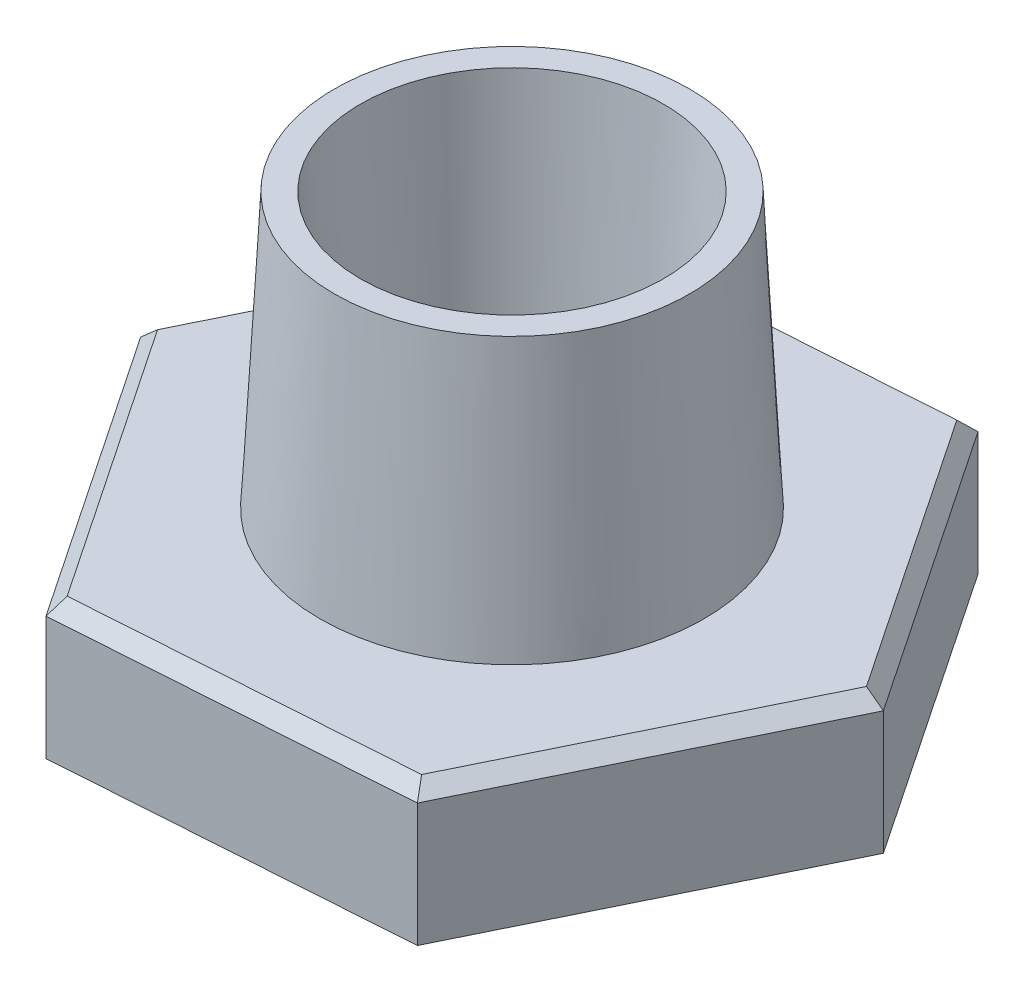
ISO-10303-21;
HEADER;
FILE_DESCRIPTION(('STEP AP214'),'2;1');
FILE_NAME('part.step','',(''),(''),'','','');
FILE_SCHEMA(('AUTOMOTIVE_DESIGN { 1 0 10303 214 1 1 1 1 }'));
ENDSEC;
DATA;
#1=APPLICATION_CONTEXT('core data for automotive mechanical design processes');
#2=APPLICATION_PROTOCOL_DEFINITION('international standard','automotive_design',2000,#1);
#3=PRODUCT_CONTEXT('',#1,'mechanical');
#4=PRODUCT('Part','Part','',(#3));
#5=PRODUCT_RELATED_PRODUCT_CATEGORY('part','',(#4));
#6=PRODUCT_DEFINITION_FORMATION('','',#4);
#7=PRODUCT_DEFINITION_CONTEXT('part definition',#1,'design');
#8=PRODUCT_DEFINITION('design','',#6,#7);
#9=PRODUCT_DEFINITION_SHAPE('','',#8);
#10=(LENGTH_UNIT() NAMED_UNIT(*) SI_UNIT(.MILLI.,.METRE.));
#11=(NAMED_UNIT(*) PLANE_ANGLE_UNIT() SI_UNIT($,.RADIAN.));
#12=(NAMED_UNIT(*) SI_UNIT($,.STERADIAN.) SOLID_ANGLE_UNIT());
#13=UNCERTAINTY_MEASURE_WITH_UNIT(LENGTH_MEASURE(1.E-05),#10,'distance_accuracy_value','');
#14=(GEOMETRIC_REPRESENTATION_CONTEXT(3) GLOBAL_UNCERTAINTY_ASSIGNED_CONTEXT((#13)) GLOBAL_UNIT_ASSIGNED_CONTEXT((#10,
#11,#12)) REPRESENTATION_CONTEXT('',''));
#15=CARTESIAN_POINT('',(0.,0.,0.));
#16=DIRECTION('',(0.,0.,1.));
#17=DIRECTION('',(1.,0.,0.));
#18=AXIS2_PLACEMENT_3D('',#15,#16,#17);
#19=CARTESIAN_POINT('',(0.,5.,0.));
#20=DIRECTION('',(0.,1.,0.));
#21=DIRECTION('',(0.,0.,1.));
#22=AXIS2_PLACEMENT_3D('',#19,#20,#21);
#23=PLANE('',#22);
#24=DIRECTION('',(-0.439571584386318,0.,0.898207560756478));
#25=VECTOR('',#24,1.);
#26=CARTESIAN_POINT('',(-12.2228338862521,5.,1.08888251084367));
#27=LINE('',#26,#25);
#28=CARTESIAN_POINT('',(-6.76641827592076,5.,-10.0605955944609));
#29=VERTEX_POINT('',#28);
#30=CARTESIAN_POINT('',(-12.0959404999653,5.,0.829592322348212));
#31=VERTEX_POINT('',#30);
#32=EDGE_CURVE('E115',#29,#31,#27,.T.);
#33=ORIENTED_EDGE('',*,*,#32,.T.);
#34=DIRECTION('',(0.558084773293205,0.,0.829783939238566));
#35=VECTOR('',#34,1.);
#36=CARTESIAN_POINT('',(-5.16841702699885,5.,11.1297259071535));
#37=LINE('',#36,#35);
#38=CARTESIAN_POINT('',(-5.32952222404458,5.,10.8901879168091));
#39=VERTEX_POINT('',#38);
#40=EDGE_CURVE('E164',#31,#39,#37,.T.);
#41=ORIENTED_EDGE('',*,*,#40,.T.);
#42=DIRECTION('',(0.997656357679524,0.,-0.0684236215179123));
#43=VECTOR('',#42,1.);
#44=CARTESIAN_POINT('',(7.05441685925327,5.,10.0408433963098));
#45=LINE('',#44,#43);
#46=CARTESIAN_POINT('',(6.76641827592076,5.,10.0605955944609));
#47=VERTEX_POINT('',#46);
#48=EDGE_CURVE('E162',#39,#47,#45,.T.);
#49=ORIENTED_EDGE('',*,*,#48,.T.);
#50=DIRECTION('',(0.439571584386318,0.,-0.898207560756478));
#51=VECTOR('',#50,1.);
#52=CARTESIAN_POINT('',(12.2228338862521,5.,-1.08888251084367));
#53=LINE('',#52,#51);
#54=CARTESIAN_POINT('',(12.0959404999653,5.,-0.829592322348215));
#55=VERTEX_POINT('',#54);
#56=EDGE_CURVE('E160',#47,#55,#53,.T.);
#57=ORIENTED_EDGE('',*,*,#56,.T.);
#58=DIRECTION('',(-0.558084773293205,0.,-0.829783939238566));
#59=VECTOR('',#58,1.);
#60=CARTESIAN_POINT('',(5.16841702699886,5.,-11.1297259071535));
#61=LINE('',#60,#59);
#62=CARTESIAN_POINT('',(5.32952222404459,5.,-10.8901879168091));
#63=VERTEX_POINT('',#62);
#64=EDGE_CURVE('E158',#55,#63,#61,.T.);
#65=ORIENTED_EDGE('',*,*,#64,.T.);
#66=DIRECTION('',(-0.997656357679524,0.,0.0684236215179122));
#67=VECTOR('',#66,1.);
#68=CARTESIAN_POINT('',(-7.05441685925327,5.,-10.0408433963098));
#69=LINE('',#68,#67);
#70=EDGE_CURVE('E156',#63,#29,#69,.T.);
#71=ORIENTED_EDGE('',*,*,#70,.T.);
#72=EDGE_LOOP('',(#33,#41,#49,#57,#65,#71));
#73=FACE_BOUND('',#72,.T.);
#74=CARTESIAN_POINT('',(0.,5.,0.));
#75=DIRECTION('',(0.,1.,0.));
#76=DIRECTION('',(0.,0.,1.));
#77=AXIS2_PLACEMENT_3D('',#74,#75,#76);
#78=CIRCLE('',#77,7.);
#79=CARTESIAN_POINT('',(0.,5.,7.));
#80=VERTEX_POINT('',#79);
#81=EDGE_CURVE('E283',#80,#80,#78,.T.);
#82=ORIENTED_EDGE('',*,*,#81,.F.);
#83=EDGE_LOOP('',(#82));
#84=FACE_BOUND('',#83,.T.);
#85=ADVANCED_FACE('F33',(#73,#84),#23,.T.);
#86=CARTESIAN_POINT('',(0.,0.,0.));
#87=DIRECTION('',(0.,1.,0.));
#88=DIRECTION('',(0.,0.,1.));
#89=AXIS2_PLACEMENT_3D('',#86,#87,#88);
#90=PLANE('',#89);
#91=DIRECTION('',(0.997656357679524,0.,-0.0684236215179123));
#92=VECTOR('',#91,1.);
#93=CARTESIAN_POINT('',(-5.58330899661814,0.,11.4087682938001));
#94=LINE('',#93,#92);
#95=CARTESIAN_POINT('',(-5.58330899661814,0.,11.4087682938001));
#96=VERTEX_POINT('',#95);
#97=CARTESIAN_POINT('',(7.08862867001223,0.,10.5396715751496));
#98=VERTEX_POINT('',#97);
#99=EDGE_CURVE('E123',#96,#98,#94,.T.);
#100=ORIENTED_EDGE('',*,*,#99,.F.);
#101=DIRECTION('',(0.558084773293205,0.,0.829783939238566));
#102=VECTOR('',#101,1.);
#103=CARTESIAN_POINT('',(-12.6719376666304,0.,0.869096718650508));
#104=LINE('',#103,#102);
#105=CARTESIAN_POINT('',(-12.6719376666304,0.,0.869096718650508));
#106=VERTEX_POINT('',#105);
#107=EDGE_CURVE('E145',#106,#96,#104,.T.);
#108=ORIENTED_EDGE('',*,*,#107,.F.);
#109=DIRECTION('',(-0.439571584386318,0.,0.898207560756478));
#110=VECTOR('',#109,1.);
#111=CARTESIAN_POINT('',(-7.08862867001223,0.,-10.5396715751496));
#112=LINE('',#111,#110);
#113=CARTESIAN_POINT('',(-7.08862867001223,0.,-10.5396715751496));
#114=VERTEX_POINT('',#113);
#115=EDGE_CURVE('E142',#114,#106,#112,.T.);
#116=ORIENTED_EDGE('',*,*,#115,.F.);
#117=DIRECTION('',(-0.997656357679524,0.,0.0684236215179122));
#118=VECTOR('',#117,1.);
#119=CARTESIAN_POINT('',(5.58330899661814,0.,-11.4087682938001));
#120=LINE('',#119,#118);
#121=CARTESIAN_POINT('',(5.58330899661814,0.,-11.4087682938001));
#122=VERTEX_POINT('',#121);
#123=EDGE_CURVE('E139',#122,#114,#120,.T.);
#124=ORIENTED_EDGE('',*,*,#123,.F.);
#125=DIRECTION('',(-0.558084773293205,0.,-0.829783939238566));
#126=VECTOR('',#125,1.);
#127=CARTESIAN_POINT('',(12.6719376666304,0.,-0.869096718650511));
#128=LINE('',#127,#126);
#129=CARTESIAN_POINT('',(12.6719376666304,0.,-0.869096718650511));
#130=VERTEX_POINT('',#129);
#131=EDGE_CURVE('E126',#130,#122,#128,.T.);
#132=ORIENTED_EDGE('',*,*,#131,.F.);
#133=DIRECTION('',(0.439571584386318,0.,-0.898207560756478));
#134=VECTOR('',#133,1.);
#135=CARTESIAN_POINT('',(7.08862867001223,0.,10.5396715751496));
#136=LINE('',#135,#134);
#137=EDGE_CURVE('E108',#98,#130,#136,.T.);
#138=ORIENTED_EDGE('',*,*,#137,.F.);
#139=EDGE_LOOP('',(#100,#108,#116,#124,#132,#138));
#140=FACE_BOUND('',#139,.T.);
#141=CARTESIAN_POINT('',(0.,0.,0.));
#142=DIRECTION('',(0.,1.,0.));
#143=DIRECTION('',(0.,0.,1.));
#144=AXIS2_PLACEMENT_3D('',#141,#142,#143);
#145=CIRCLE('',#144,5.);
#146=CARTESIAN_POINT('',(0.,0.,5.));
#147=VERTEX_POINT('',#146);
#148=EDGE_CURVE('E132',#147,#147,#145,.T.);
#149=ORIENTED_EDGE('',*,*,#148,.T.);
#150=EDGE_LOOP('',(#149));
#151=FACE_BOUND('',#150,.T.);
#152=ADVANCED_FACE('F120',(#140,#151),#90,.F.);
#153=CARTESIAN_POINT('',(-5.58330899661814,5.,11.4087682938001));
#154=DIRECTION('',(-0.0684236215179123,0.,-0.997656357679524));
#155=DIRECTION('',(-0.997656357679524,0.,0.0684236215179123));
#156=AXIS2_PLACEMENT_3D('',#153,#154,#155);
#157=PLANE('',#156);
#158=DIRECTION('',(0.,-1.,0.));
#159=VECTOR('',#158,1.);
#160=CARTESIAN_POINT('',(7.08862867001223,5.,10.5396715751496));
#161=LINE('',#160,#159);
#162=CARTESIAN_POINT('',(7.08862867001223,4.49999999999999,10.5396715751496));
#163=VERTEX_POINT('',#162);
#164=EDGE_CURVE('E104',#163,#98,#161,.T.);
#165=ORIENTED_EDGE('',*,*,#164,.F.);
#166=DIRECTION('',(-0.997656357679524,0.,0.0684236215179123));
#167=VECTOR('',#166,1.);
#168=CARTESIAN_POINT('',(-5.58330899661814,4.49999999999999,11.4087682938001));
#169=LINE('',#168,#167);
#170=CARTESIAN_POINT('',(-5.58330899661814,4.49999999999999,11.4087682938001));
#171=VERTEX_POINT('',#170);
#172=EDGE_CURVE('E170',#163,#171,#169,.T.);
#173=ORIENTED_EDGE('',*,*,#172,.T.);
#174=DIRECTION('',(0.,-1.,0.));
#175=VECTOR('',#174,1.);
#176=CARTESIAN_POINT('',(-5.58330899661814,5.,11.4087682938001));
#177=LINE('',#176,#175);
#178=EDGE_CURVE('E130',#171,#96,#177,.T.);
#179=ORIENTED_EDGE('',*,*,#178,.T.);
#180=ORIENTED_EDGE('',*,*,#99,.T.);
#181=EDGE_LOOP('',(#165,#173,#179,#180));
#182=FACE_BOUND('',#181,.T.);
#183=ADVANCED_FACE('F128',(#182),#157,.F.);
#184=CARTESIAN_POINT('',(7.08862867001223,5.,10.5396715751496));
#185=DIRECTION('',(-0.898207560756478,0.,-0.439571584386318));
#186=DIRECTION('',(-0.439571584386318,0.,0.898207560756478));
#187=AXIS2_PLACEMENT_3D('',#184,#185,#186);
#188=PLANE('',#187);
#189=DIRECTION('',(0.,-1.,0.));
#190=VECTOR('',#189,1.);
#191=CARTESIAN_POINT('',(12.6719376666304,5.,-0.869096718650511));
#192=LINE('',#191,#190);
#193=CARTESIAN_POINT('',(12.6719376666304,4.49999999999999,-0.869096718650511));
#194=VERTEX_POINT('',#193);
#195=EDGE_CURVE('E116',#194,#130,#192,.T.);
#196=ORIENTED_EDGE('',*,*,#195,.F.);
#197=DIRECTION('',(-0.439571584386318,0.,0.898207560756478));
#198=VECTOR('',#197,1.);
#199=CARTESIAN_POINT('',(7.08862867001223,4.49999999999999,10.5396715751496));
#200=LINE('',#199,#198);
#201=EDGE_CURVE('E111',#194,#163,#200,.T.);
#202=ORIENTED_EDGE('',*,*,#201,.T.);
#203=ORIENTED_EDGE('',*,*,#164,.T.);
#204=ORIENTED_EDGE('',*,*,#137,.T.);
#205=EDGE_LOOP('',(#196,#202,#203,#204));
#206=FACE_BOUND('',#205,.T.);
#207=ADVANCED_FACE('F107',(#206),#188,.F.);
#208=CARTESIAN_POINT('',(12.6719376666304,5.,-0.869096718650511));
#209=DIRECTION('',(-0.829783939238566,0.,0.558084773293205));
#210=DIRECTION('',(0.558084773293205,0.,0.829783939238566));
#211=AXIS2_PLACEMENT_3D('',#208,#209,#210);
#212=PLANE('',#211);
#213=DIRECTION('',(0.,-1.,0.));
#214=VECTOR('',#213,1.);
#215=CARTESIAN_POINT('',(5.58330899661814,5.,-11.4087682938001));
#216=LINE('',#215,#214);
#217=CARTESIAN_POINT('',(5.58330899661814,4.49999999999999,-11.4087682938001));
#218=VERTEX_POINT('',#217);
#219=EDGE_CURVE('E152',#218,#122,#216,.T.);
#220=ORIENTED_EDGE('',*,*,#219,.F.);
#221=DIRECTION('',(0.558084773293205,0.,0.829783939238566));
#222=VECTOR('',#221,1.);
#223=CARTESIAN_POINT('',(12.6719376666304,4.49999999999999,-0.869096718650511));
#224=LINE('',#223,#222);
#225=EDGE_CURVE('E173',#218,#194,#224,.T.);
#226=ORIENTED_EDGE('',*,*,#225,.T.);
#227=ORIENTED_EDGE('',*,*,#195,.T.);
#228=ORIENTED_EDGE('',*,*,#131,.T.);
#229=EDGE_LOOP('',(#220,#226,#227,#228));
#230=FACE_BOUND('',#229,.T.);
#231=ADVANCED_FACE('F201',(#230),#212,.F.);
#232=CARTESIAN_POINT('',(5.58330899661814,5.,-11.4087682938001));
#233=DIRECTION('',(0.0684236215179122,0.,0.997656357679524));
#234=DIRECTION('',(0.997656357679524,0.,-0.0684236215179122));
#235=AXIS2_PLACEMENT_3D('',#232,#233,#234);
#236=PLANE('',#235);
#237=DIRECTION('',(0.,-1.,0.));
#238=VECTOR('',#237,1.);
#239=CARTESIAN_POINT('',(-7.08862867001223,5.,-10.5396715751496));
#240=LINE('',#239,#238);
#241=CARTESIAN_POINT('',(-7.08862867001223,4.49999999999999,-10.5396715751496));
#242=VERTEX_POINT('',#241);
#243=EDGE_CURVE('E150',#242,#114,#240,.T.);
#244=ORIENTED_EDGE('',*,*,#243,.F.);
#245=DIRECTION('',(0.997656357679524,0.,-0.0684236215179122));
#246=VECTOR('',#245,1.);
#247=CARTESIAN_POINT('',(5.58330899661814,4.49999999999999,-11.4087682938001));
#248=LINE('',#247,#246);
#249=EDGE_CURVE('E42',#242,#218,#248,.T.);
#250=ORIENTED_EDGE('',*,*,#249,.T.);
#251=ORIENTED_EDGE('',*,*,#219,.T.);
#252=ORIENTED_EDGE('',*,*,#123,.T.);
#253=EDGE_LOOP('',(#244,#250,#251,#252));
#254=FACE_BOUND('',#253,.T.);
#255=ADVANCED_FACE('F202',(#254),#236,.F.);
#256=CARTESIAN_POINT('',(-7.08862867001223,5.,-10.5396715751496));
#257=DIRECTION('',(0.898207560756478,0.,0.439571584386318));
#258=DIRECTION('',(0.439571584386318,0.,-0.898207560756478));
#259=AXIS2_PLACEMENT_3D('',#256,#257,#258);
#260=PLANE('',#259);
#261=DIRECTION('',(0.,-1.,0.));
#262=VECTOR('',#261,1.);
#263=CARTESIAN_POINT('',(-12.6719376666304,5.,0.869096718650508));
#264=LINE('',#263,#262);
#265=CARTESIAN_POINT('',(-12.6719376666304,4.49999999999999,0.869096718650508));
#266=VERTEX_POINT('',#265);
#267=EDGE_CURVE('E148',#266,#106,#264,.T.);
#268=ORIENTED_EDGE('',*,*,#267,.F.);
#269=DIRECTION('',(0.439571584386318,0.,-0.898207560756478));
#270=VECTOR('',#269,1.);
#271=CARTESIAN_POINT('',(-7.08862867001223,4.49999999999999,-10.5396715751496));
#272=LINE('',#271,#270);
#273=EDGE_CURVE('E11',#266,#242,#272,.T.);
#274=ORIENTED_EDGE('',*,*,#273,.T.);
#275=ORIENTED_EDGE('',*,*,#243,.T.);
#276=ORIENTED_EDGE('',*,*,#115,.T.);
#277=EDGE_LOOP('',(#268,#274,#275,#276));
#278=FACE_BOUND('',#277,.T.);
#279=ADVANCED_FACE('F204',(#278),#260,.F.);
#280=CARTESIAN_POINT('',(-12.6719376666304,5.,0.869096718650508));
#281=DIRECTION('',(0.829783939238566,0.,-0.558084773293205));
#282=DIRECTION('',(-0.558084773293205,0.,-0.829783939238566));
#283=AXIS2_PLACEMENT_3D('',#280,#281,#282);
#284=PLANE('',#283);
#285=ORIENTED_EDGE('',*,*,#178,.F.);
#286=DIRECTION('',(-0.558084773293205,0.,-0.829783939238566));
#287=VECTOR('',#286,1.);
#288=CARTESIAN_POINT('',(-12.6719376666304,4.49999999999999,0.869096718650508));
#289=LINE('',#288,#287);
#290=EDGE_CURVE('E167',#171,#266,#289,.T.);
#291=ORIENTED_EDGE('',*,*,#290,.T.);
#292=ORIENTED_EDGE('',*,*,#267,.T.);
#293=ORIENTED_EDGE('',*,*,#107,.T.);
#294=EDGE_LOOP('',(#285,#291,#292,#293));
#295=FACE_BOUND('',#294,.T.);
#296=ADVANCED_FACE('F206',(#295),#284,.F.);
#297=CARTESIAN_POINT('',(0.,5.,0.));
#298=DIRECTION('',(0.,-1.,0.));
#299=DIRECTION('',(0.,0.,-1.));
#300=AXIS2_PLACEMENT_3D('',#297,#298,#299);
#301=CYLINDRICAL_SURFACE('',#300,5.);
#302=CARTESIAN_POINT('',(0.,5.,0.));
#303=DIRECTION('',(0.,1.,0.));
#304=DIRECTION('',(0.,0.,1.));
#305=AXIS2_PLACEMENT_3D('',#302,#303,#304);
#306=CIRCLE('',#305,5.);
#307=CARTESIAN_POINT('',(0.,5.,5.));
#308=VERTEX_POINT('',#307);
#309=EDGE_CURVE('E280',#308,#308,#306,.T.);
#310=ORIENTED_EDGE('',*,*,#309,.T.);
#311=EDGE_LOOP('',(#310));
#312=FACE_BOUND('',#311,.T.);
#313=ORIENTED_EDGE('',*,*,#148,.F.);
#314=EDGE_LOOP('',(#313));
#315=FACE_BOUND('',#314,.T.);
#316=ADVANCED_FACE('F240',(#312,#315),#301,.F.);
#317=CARTESIAN_POINT('',(8.71273136200497,5.,-5.85989011957868));
#318=DIRECTION('',(0.586745850355278,0.707106781186545,-0.394625527672584));
#319=DIRECTION('',(0.558084773293205,0.,0.829783939238566));
#320=AXIS2_PLACEMENT_3D('',#317,#318,#319);
#321=PLANE('',#320);
#322=DIRECTION('',(0.75415731894929,-0.65465367070798,-0.0517233960968021));
#323=VECTOR('',#322,1.);
#324=CARTESIAN_POINT('',(10.3679489999703,6.5,-0.711079133441323));
#325=LINE('',#324,#323);
#326=EDGE_CURVE('E186',#194,#55,#325,.F.);
#327=ORIENTED_EDGE('',*,*,#326,.F.);
#328=ORIENTED_EDGE('',*,*,#225,.F.);
#329=DIRECTION('',(0.332284884484811,-0.65465367070798,-0.678981094708449));
#330=VECTOR('',#329,1.);
#331=CARTESIAN_POINT('',(4.56816190632394,6.50000000000001,-9.33444678583642));
#332=LINE('',#331,#330);
#333=EDGE_CURVE('E37',#63,#218,#332,.T.);
#334=ORIENTED_EDGE('',*,*,#333,.F.);
#335=ORIENTED_EDGE('',*,*,#64,.F.);
#336=EDGE_LOOP('',(#327,#328,#334,#335));
#337=FACE_BOUND('',#336,.T.);
#338=ADVANCED_FACE('F35',(#337),#321,.T.);
#339=CARTESIAN_POINT('',(-0.718448025938081,5.,-10.475391755635));
#340=DIRECTION('',(-0.0483828067686577,0.707106781186545,-0.705449575809066));
#341=DIRECTION('',(0.997656357679524,0.,-0.0684236215179122));
#342=AXIS2_PLACEMENT_3D('',#339,#340,#341);
#343=PLANE('',#342);
#344=ORIENTED_EDGE('',*,*,#333,.T.);
#345=ORIENTED_EDGE('',*,*,#249,.F.);
#346=DIRECTION('',(-0.421872434464479,-0.65465367070798,-0.627257698611648));
#347=VECTOR('',#346,1.);
#348=CARTESIAN_POINT('',(-5.79978709364637,6.50000000000001,-8.62336765239509));
#349=LINE('',#348,#347);
#350=EDGE_CURVE('E184',#29,#242,#349,.T.);
#351=ORIENTED_EDGE('',*,*,#350,.F.);
#352=ORIENTED_EDGE('',*,*,#70,.F.);
#353=EDGE_LOOP('',(#344,#345,#351,#352));
#354=FACE_BOUND('',#353,.T.);
#355=ADVANCED_FACE('F195',(#354),#343,.T.);
#356=CARTESIAN_POINT('',(9.43117938794306,5.,4.61550163605636));
#357=DIRECTION('',(0.635128657123937,0.707106781186544,0.310824048136482));
#358=DIRECTION('',(-0.439571584386318,0.,0.898207560756478));
#359=AXIS2_PLACEMENT_3D('',#356,#357,#358);
#360=PLANE('',#359);
#361=ORIENTED_EDGE('',*,*,#326,.T.);
#362=ORIENTED_EDGE('',*,*,#56,.F.);
#363=DIRECTION('',(0.42187243446448,-0.654653670707981,0.627257698611646));
#364=VECTOR('',#363,1.);
#365=CARTESIAN_POINT('',(5.79978709364637,6.50000000000001,8.62336765239511));
#366=LINE('',#365,#364);
#367=EDGE_CURVE('E181',#163,#47,#366,.F.);
#368=ORIENTED_EDGE('',*,*,#367,.F.);
#369=ORIENTED_EDGE('',*,*,#201,.F.);
#370=EDGE_LOOP('',(#361,#362,#368,#369));
#371=FACE_BOUND('',#370,.T.);
#372=ADVANCED_FACE('F223',(#371),#360,.T.);
#373=CARTESIAN_POINT('',(-9.43117938794306,5.,-4.61550163605635));
#374=DIRECTION('',(-0.635128657123936,0.707106781186544,-0.310824048136481));
#375=DIRECTION('',(0.439571584386318,0.,-0.898207560756478));
#376=AXIS2_PLACEMENT_3D('',#373,#374,#375);
#377=PLANE('',#376);
#378=ORIENTED_EDGE('',*,*,#350,.T.);
#379=ORIENTED_EDGE('',*,*,#273,.F.);
#380=DIRECTION('',(0.75415731894929,0.654653670707981,-0.0517233960968006));
#381=VECTOR('',#380,1.);
#382=CARTESIAN_POINT('',(-10.3679489999703,6.5,0.711079133441326));
#383=LINE('',#382,#381);
#384=EDGE_CURVE('E178',#31,#266,#383,.F.);
#385=ORIENTED_EDGE('',*,*,#384,.F.);
#386=ORIENTED_EDGE('',*,*,#32,.F.);
#387=EDGE_LOOP('',(#378,#379,#385,#386));
#388=FACE_BOUND('',#387,.T.);
#389=ADVANCED_FACE('F221',(#388),#377,.T.);
#390=CARTESIAN_POINT('',(0.718448025938082,5.,10.475391755635));
#391=DIRECTION('',(0.0483828067686578,0.707106781186543,0.705449575809067));
#392=DIRECTION('',(-0.997656357679524,0.,0.0684236215179123));
#393=AXIS2_PLACEMENT_3D('',#390,#391,#392);
#394=PLANE('',#393);
#395=ORIENTED_EDGE('',*,*,#367,.T.);
#396=ORIENTED_EDGE('',*,*,#48,.F.);
#397=DIRECTION('',(-0.332284884484811,-0.654653670707981,0.678981094708447));
#398=VECTOR('',#397,1.);
#399=CARTESIAN_POINT('',(-4.56816190632393,6.50000000000001,9.33444678583643));
#400=LINE('',#399,#398);
#401=EDGE_CURVE('E176',#171,#39,#400,.F.);
#402=ORIENTED_EDGE('',*,*,#401,.F.);
#403=ORIENTED_EDGE('',*,*,#172,.F.);
#404=EDGE_LOOP('',(#395,#396,#402,#403));
#405=FACE_BOUND('',#404,.T.);
#406=ADVANCED_FACE('F216',(#405),#394,.T.);
#407=CARTESIAN_POINT('',(-8.71273136200497,5.,5.85989011957868));
#408=DIRECTION('',(-0.586745850355279,0.707106781186544,0.394625527672585));
#409=DIRECTION('',(-0.558084773293205,0.,-0.829783939238566));
#410=AXIS2_PLACEMENT_3D('',#407,#408,#409);
#411=PLANE('',#410);
#412=ORIENTED_EDGE('',*,*,#384,.T.);
#413=ORIENTED_EDGE('',*,*,#290,.F.);
#414=ORIENTED_EDGE('',*,*,#401,.T.);
#415=ORIENTED_EDGE('',*,*,#40,.F.);
#416=EDGE_LOOP('',(#412,#413,#414,#415));
#417=FACE_BOUND('',#416,.T.);
#418=ADVANCED_FACE('F210',(#417),#411,.T.);
#419=CARTESIAN_POINT('',(0.,15.,0.));
#420=DIRECTION('',(0.,1.,0.));
#421=DIRECTION('',(0.,0.,1.));
#422=AXIS2_PLACEMENT_3D('',#419,#420,#421);
#423=PLANE('',#422);
#424=CARTESIAN_POINT('',(0.,15.,0.));
#425=DIRECTION('',(0.,1.,0.));
#426=DIRECTION('',(0.,0.,1.));
#427=AXIS2_PLACEMENT_3D('',#424,#425,#426);
#428=CIRCLE('',#427,6.47592220716959);
#429=CARTESIAN_POINT('',(0.,15.,6.47592220716959));
#430=VERTEX_POINT('',#429);
#431=EDGE_CURVE('E179',#430,#430,#428,.T.);
#432=ORIENTED_EDGE('',*,*,#431,.T.);
#433=EDGE_LOOP('',(#432));
#434=FACE_BOUND('',#433,.T.);
#435=CARTESIAN_POINT('',(0.,15.,0.));
#436=DIRECTION('',(0.,1.,0.));
#437=DIRECTION('',(0.,0.,1.));
#438=AXIS2_PLACEMENT_3D('',#435,#436,#437);
#439=CIRCLE('',#438,5.52407779283041);
#440=CARTESIAN_POINT('',(0.,15.,5.52407779283041));
#441=VERTEX_POINT('',#440);
#442=EDGE_CURVE('E277',#441,#441,#439,.T.);
#443=ORIENTED_EDGE('',*,*,#442,.F.);
#444=EDGE_LOOP('',(#443));
#445=FACE_BOUND('',#444,.T.);
#446=ADVANCED_FACE('F256',(#434,#445),#423,.T.);
#447=CARTESIAN_POINT('',(0.,5.,0.));
#448=DIRECTION('',(0.,-1.,0.));
#449=DIRECTION('',(0.,0.,1.));
#450=AXIS2_PLACEMENT_3D('',#447,#448,#449);
#451=CONICAL_SURFACE('',#450,7.,0.0523598775598299);
#452=ORIENTED_EDGE('',*,*,#431,.F.);
#453=EDGE_LOOP('',(#452));
#454=FACE_BOUND('',#453,.T.);
#455=ORIENTED_EDGE('',*,*,#81,.T.);
#456=EDGE_LOOP('',(#455));
#457=FACE_BOUND('',#456,.T.);
#458=ADVANCED_FACE('F260',(#454,#457),#451,.T.);
#459=CARTESIAN_POINT('',(0.,5.,0.));
#460=DIRECTION('',(0.,1.,0.));
#461=DIRECTION('',(0.,0.,1.));
#462=AXIS2_PLACEMENT_3D('',#459,#460,#461);
#463=CONICAL_SURFACE('',#462,5.,0.0523598775598299);
#464=ORIENTED_EDGE('',*,*,#442,.T.);
#465=EDGE_LOOP('',(#464));
#466=FACE_BOUND('',#465,.T.);
#467=ORIENTED_EDGE('',*,*,#309,.F.);
#468=EDGE_LOOP('',(#467));
#469=FACE_BOUND('',#468,.T.);
#470=ADVANCED_FACE('F265',(#466,#469),#463,.F.);
#471=CLOSED_SHELL('',(#85,#152,#183,#207,#231,#255,#279,#296,#316,#338,#355,#372,#389,#406,#418,
#446,#458,#470));
#472=MANIFOLD_SOLID_BREP('B2',#471);
#473=ADVANCED_BREP_SHAPE_REPRESENTATION('',(#18,#472),#14);
#474=SHAPE_DEFINITION_REPRESENTATION(#9,#473);
ENDSEC;
END-ISO-10303-21;
